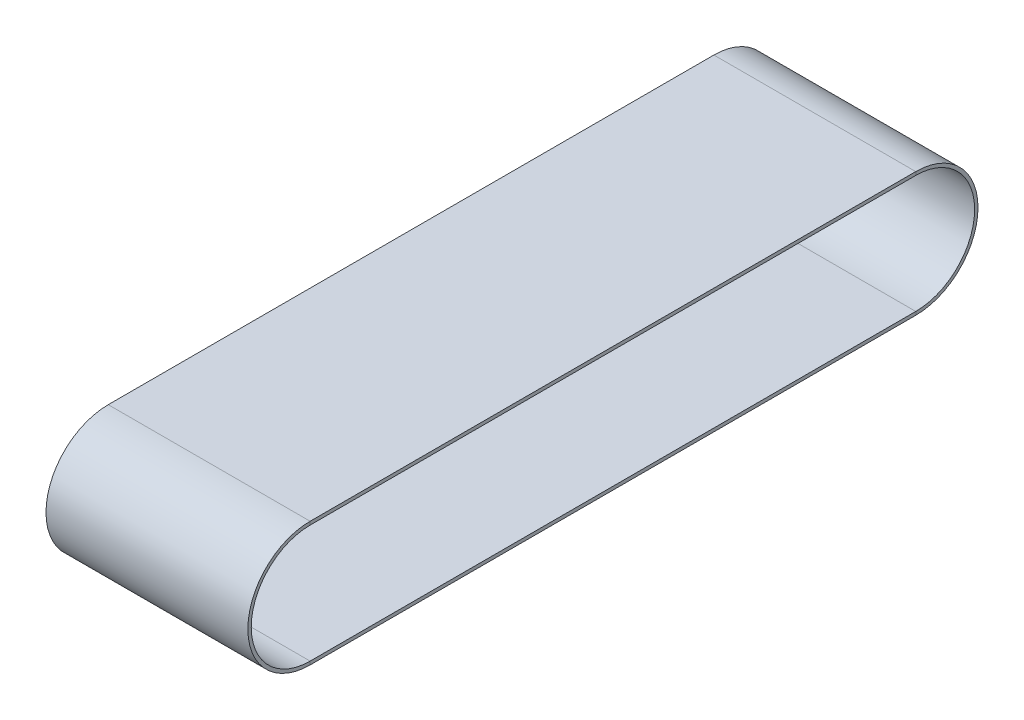
ISO-10303-21;
HEADER;
FILE_DESCRIPTION(('STEP AP214'),'2;1');
FILE_NAME('part.step','',(''),(''),'','','');
FILE_SCHEMA(('AUTOMOTIVE_DESIGN { 1 0 10303 214 1 1 1 1 }'));
ENDSEC;
DATA;
#1=APPLICATION_CONTEXT('core data for automotive mechanical design processes');
#2=APPLICATION_PROTOCOL_DEFINITION('international standard','automotive_design',2000,#1);
#3=PRODUCT_CONTEXT('',#1,'mechanical');
#4=PRODUCT('Part','Part','',(#3));
#5=PRODUCT_RELATED_PRODUCT_CATEGORY('part','',(#4));
#6=PRODUCT_DEFINITION_FORMATION('','',#4);
#7=PRODUCT_DEFINITION_CONTEXT('part definition',#1,'design');
#8=PRODUCT_DEFINITION('design','',#6,#7);
#9=PRODUCT_DEFINITION_SHAPE('','',#8);
#10=(LENGTH_UNIT() NAMED_UNIT(*) SI_UNIT(.MILLI.,.METRE.));
#11=(NAMED_UNIT(*) PLANE_ANGLE_UNIT() SI_UNIT($,.RADIAN.));
#12=(NAMED_UNIT(*) SI_UNIT($,.STERADIAN.) SOLID_ANGLE_UNIT());
#13=UNCERTAINTY_MEASURE_WITH_UNIT(LENGTH_MEASURE(1.E-05),#10,'distance_accuracy_value','');
#14=(GEOMETRIC_REPRESENTATION_CONTEXT(3) GLOBAL_UNCERTAINTY_ASSIGNED_CONTEXT((#13)) GLOBAL_UNIT_ASSIGNED_CONTEXT((#10,
#11,#12)) REPRESENTATION_CONTEXT('',''));
#15=CARTESIAN_POINT('',(0.,0.,0.));
#16=DIRECTION('',(0.,0.,1.));
#17=DIRECTION('',(1.,0.,0.));
#18=AXIS2_PLACEMENT_3D('',#15,#16,#17);
#19=CARTESIAN_POINT('',(-76.2,44.45,-457.2));
#20=DIRECTION('',(-1.,0.,0.));
#21=DIRECTION('',(0.,0.,1.));
#22=AXIS2_PLACEMENT_3D('',#19,#20,#21);
#23=PLANE('',#22);
#24=DIRECTION('',(0.,0.,1.));
#25=VECTOR('',#24,1.);
#26=CARTESIAN_POINT('',(-76.2,46.99,-457.2));
#27=LINE('',#26,#25);
#28=CARTESIAN_POINT('',(-76.2,46.99,-457.2));
#29=VERTEX_POINT('',#28);
#30=CARTESIAN_POINT('',(-76.2,46.99,0.));
#31=VERTEX_POINT('',#30);
#32=EDGE_CURVE('E11',#29,#31,#27,.T.);
#33=ORIENTED_EDGE('',*,*,#32,.F.);
#34=DIRECTION('',(0.,-1.,0.));
#35=VECTOR('',#34,1.);
#36=CARTESIAN_POINT('',(-76.2,44.45,-457.2));
#37=LINE('',#36,#35);
#38=CARTESIAN_POINT('',(-76.2,44.45,-457.2));
#39=VERTEX_POINT('',#38);
#40=EDGE_CURVE('E36',#29,#39,#37,.T.);
#41=ORIENTED_EDGE('',*,*,#40,.T.);
#42=DIRECTION('',(0.,0.,1.));
#43=VECTOR('',#42,1.);
#44=CARTESIAN_POINT('',(-76.2,44.45,-457.2));
#45=LINE('',#44,#43);
#46=CARTESIAN_POINT('',(-76.2,44.45,0.));
#47=VERTEX_POINT('',#46);
#48=EDGE_CURVE('E121',#39,#47,#45,.T.);
#49=ORIENTED_EDGE('',*,*,#48,.T.);
#50=DIRECTION('',(0.,-1.,0.));
#51=VECTOR('',#50,1.);
#52=CARTESIAN_POINT('',(-76.2,44.45,0.));
#53=LINE('',#52,#51);
#54=EDGE_CURVE('E124',#31,#47,#53,.T.);
#55=ORIENTED_EDGE('',*,*,#54,.F.);
#56=EDGE_LOOP('',(#33,#41,#49,#55));
#57=FACE_BOUND('',#56,.T.);
#58=ADVANCED_FACE('F33',(#57),#23,.T.);
#59=CARTESIAN_POINT('',(-76.2,46.99,-457.2));
#60=DIRECTION('',(0.,1.,0.));
#61=DIRECTION('',(-1.,0.,0.));
#62=AXIS2_PLACEMENT_3D('',#59,#60,#61);
#63=PLANE('',#62);
#64=DIRECTION('',(0.,0.,1.));
#65=VECTOR('',#64,1.);
#66=CARTESIAN_POINT('',(76.2,46.99,-457.2));
#67=LINE('',#66,#65);
#68=CARTESIAN_POINT('',(76.2,46.99,-457.2));
#69=VERTEX_POINT('',#68);
#70=CARTESIAN_POINT('',(76.2,46.99,0.));
#71=VERTEX_POINT('',#70);
#72=EDGE_CURVE('E41',#69,#71,#67,.T.);
#73=ORIENTED_EDGE('',*,*,#72,.F.);
#74=DIRECTION('',(-1.,0.,0.));
#75=VECTOR('',#74,1.);
#76=CARTESIAN_POINT('',(-76.2,46.99,-457.2));
#77=LINE('',#76,#75);
#78=EDGE_CURVE('E191',#69,#29,#77,.T.);
#79=ORIENTED_EDGE('',*,*,#78,.T.);
#80=ORIENTED_EDGE('',*,*,#32,.T.);
#81=DIRECTION('',(-1.,0.,0.));
#82=VECTOR('',#81,1.);
#83=CARTESIAN_POINT('',(-76.2,46.99,0.));
#84=LINE('',#83,#82);
#85=EDGE_CURVE('E149',#71,#31,#84,.T.);
#86=ORIENTED_EDGE('',*,*,#85,.F.);
#87=EDGE_LOOP('',(#73,#79,#80,#86));
#88=FACE_BOUND('',#87,.T.);
#89=ADVANCED_FACE('F215',(#88),#63,.T.);
#90=CARTESIAN_POINT('',(76.2,44.45,-457.2));
#91=DIRECTION('',(1.,0.,0.));
#92=DIRECTION('',(0.,1.,0.));
#93=AXIS2_PLACEMENT_3D('',#90,#91,#92);
#94=PLANE('',#93);
#95=DIRECTION('',(0.,0.,1.));
#96=VECTOR('',#95,1.);
#97=CARTESIAN_POINT('',(76.2,44.45,-457.2));
#98=LINE('',#97,#96);
#99=CARTESIAN_POINT('',(76.2,44.45,-457.2));
#100=VERTEX_POINT('',#99);
#101=CARTESIAN_POINT('',(76.2,44.45,0.));
#102=VERTEX_POINT('',#101);
#103=EDGE_CURVE('E130',#100,#102,#98,.T.);
#104=ORIENTED_EDGE('',*,*,#103,.F.);
#105=DIRECTION('',(0.,1.,0.));
#106=VECTOR('',#105,1.);
#107=CARTESIAN_POINT('',(76.2,44.45,-457.2));
#108=LINE('',#107,#106);
#109=EDGE_CURVE('E175',#100,#69,#108,.T.);
#110=ORIENTED_EDGE('',*,*,#109,.T.);
#111=ORIENTED_EDGE('',*,*,#72,.T.);
#112=DIRECTION('',(0.,1.,0.));
#113=VECTOR('',#112,1.);
#114=CARTESIAN_POINT('',(76.2,44.45,0.));
#115=LINE('',#114,#113);
#116=EDGE_CURVE('E153',#102,#71,#115,.T.);
#117=ORIENTED_EDGE('',*,*,#116,.F.);
#118=EDGE_LOOP('',(#104,#110,#111,#117));
#119=FACE_BOUND('',#118,.T.);
#120=ADVANCED_FACE('F220',(#119),#94,.T.);
#121=CARTESIAN_POINT('',(-76.2,-44.45,-457.2));
#122=DIRECTION('',(-1.,0.,0.));
#123=DIRECTION('',(0.,0.,1.));
#124=AXIS2_PLACEMENT_3D('',#121,#122,#123);
#125=PLANE('',#124);
#126=ORIENTED_EDGE('',*,*,#40,.F.);
#127=CARTESIAN_POINT('',(-76.2,0.,-457.2));
#128=DIRECTION('',(1.,0.,0.));
#129=DIRECTION('',(0.,-1.,0.));
#130=AXIS2_PLACEMENT_3D('',#127,#128,#129);
#131=CIRCLE('',#130,46.99);
#132=CARTESIAN_POINT('',(-76.2,-46.99,-457.2));
#133=VERTEX_POINT('',#132);
#134=EDGE_CURVE('E77',#133,#29,#131,.T.);
#135=ORIENTED_EDGE('',*,*,#134,.F.);
#136=DIRECTION('',(0.,1.,0.));
#137=VECTOR('',#136,1.);
#138=CARTESIAN_POINT('',(-76.2,-44.45,-457.2));
#139=LINE('',#138,#137);
#140=CARTESIAN_POINT('',(-76.2,-44.45,-457.2));
#141=VERTEX_POINT('',#140);
#142=EDGE_CURVE('E178',#133,#141,#139,.T.);
#143=ORIENTED_EDGE('',*,*,#142,.T.);
#144=CARTESIAN_POINT('',(-76.2,0.,-457.2));
#145=DIRECTION('',(1.,0.,0.));
#146=DIRECTION('',(0.,-1.,0.));
#147=AXIS2_PLACEMENT_3D('',#144,#145,#146);
#148=CIRCLE('',#147,44.45);
#149=EDGE_CURVE('E173',#141,#39,#148,.T.);
#150=ORIENTED_EDGE('',*,*,#149,.T.);
#151=EDGE_LOOP('',(#126,#135,#143,#150));
#152=FACE_BOUND('',#151,.T.);
#153=ADVANCED_FACE('F204',(#152),#125,.T.);
#154=CARTESIAN_POINT('',(0.,0.,-457.2));
#155=DIRECTION('',(1.,0.,0.));
#156=DIRECTION('',(0.,0.,-1.));
#157=AXIS2_PLACEMENT_3D('',#154,#155,#156);
#158=CYLINDRICAL_SURFACE('',#157,46.99);
#159=ORIENTED_EDGE('',*,*,#134,.T.);
#160=ORIENTED_EDGE('',*,*,#78,.F.);
#161=CARTESIAN_POINT('',(76.2,0.,-457.2));
#162=DIRECTION('',(1.,0.,0.));
#163=DIRECTION('',(0.,-1.,0.));
#164=AXIS2_PLACEMENT_3D('',#161,#162,#163);
#165=CIRCLE('',#164,46.99);
#166=CARTESIAN_POINT('',(76.2,-46.99,-457.2));
#167=VERTEX_POINT('',#166);
#168=EDGE_CURVE('E86',#167,#69,#165,.T.);
#169=ORIENTED_EDGE('',*,*,#168,.F.);
#170=DIRECTION('',(-1.,0.,0.));
#171=VECTOR('',#170,1.);
#172=CARTESIAN_POINT('',(-76.2,-46.99,-457.2));
#173=LINE('',#172,#171);
#174=EDGE_CURVE('E187',#167,#133,#173,.T.);
#175=ORIENTED_EDGE('',*,*,#174,.T.);
#176=EDGE_LOOP('',(#159,#160,#169,#175));
#177=FACE_BOUND('',#176,.T.);
#178=ADVANCED_FACE('F214',(#177),#158,.T.);
#179=CARTESIAN_POINT('',(76.2,-44.45,-457.2));
#180=DIRECTION('',(1.,0.,0.));
#181=DIRECTION('',(0.,0.,-1.));
#182=AXIS2_PLACEMENT_3D('',#179,#180,#181);
#183=PLANE('',#182);
#184=ORIENTED_EDGE('',*,*,#168,.T.);
#185=ORIENTED_EDGE('',*,*,#109,.F.);
#186=CARTESIAN_POINT('',(76.2,0.,-457.2));
#187=DIRECTION('',(1.,0.,0.));
#188=DIRECTION('',(0.,-1.,0.));
#189=AXIS2_PLACEMENT_3D('',#186,#187,#188);
#190=CIRCLE('',#189,44.45);
#191=CARTESIAN_POINT('',(76.2,-44.45,-457.2));
#192=VERTEX_POINT('',#191);
#193=EDGE_CURVE('E94',#192,#100,#190,.T.);
#194=ORIENTED_EDGE('',*,*,#193,.F.);
#195=DIRECTION('',(0.,-1.,0.));
#196=VECTOR('',#195,1.);
#197=CARTESIAN_POINT('',(76.2,-44.45,-457.2));
#198=LINE('',#197,#196);
#199=EDGE_CURVE('E167',#192,#167,#198,.T.);
#200=ORIENTED_EDGE('',*,*,#199,.T.);
#201=EDGE_LOOP('',(#184,#185,#194,#200));
#202=FACE_BOUND('',#201,.T.);
#203=ADVANCED_FACE('F221',(#202),#183,.T.);
#204=CARTESIAN_POINT('',(0.,0.,-457.2));
#205=DIRECTION('',(1.,0.,0.));
#206=DIRECTION('',(0.,0.,-1.));
#207=AXIS2_PLACEMENT_3D('',#204,#205,#206);
#208=CYLINDRICAL_SURFACE('',#207,44.45);
#209=ORIENTED_EDGE('',*,*,#193,.T.);
#210=DIRECTION('',(1.,0.,0.));
#211=VECTOR('',#210,1.);
#212=CARTESIAN_POINT('',(-76.2,44.45,-457.2));
#213=LINE('',#212,#211);
#214=EDGE_CURVE('E171',#39,#100,#213,.T.);
#215=ORIENTED_EDGE('',*,*,#214,.F.);
#216=ORIENTED_EDGE('',*,*,#149,.F.);
#217=DIRECTION('',(1.,0.,0.));
#218=VECTOR('',#217,1.);
#219=CARTESIAN_POINT('',(-76.2,-44.45,-457.2));
#220=LINE('',#219,#218);
#221=EDGE_CURVE('E162',#141,#192,#220,.T.);
#222=ORIENTED_EDGE('',*,*,#221,.T.);
#223=EDGE_LOOP('',(#209,#215,#216,#222));
#224=FACE_BOUND('',#223,.T.);
#225=ADVANCED_FACE('F222',(#224),#208,.F.);
#226=CARTESIAN_POINT('',(-76.2,-44.45,0.));
#227=DIRECTION('',(-1.,0.,0.));
#228=DIRECTION('',(0.,0.,1.));
#229=AXIS2_PLACEMENT_3D('',#226,#227,#228);
#230=PLANE('',#229);
#231=ORIENTED_EDGE('',*,*,#142,.F.);
#232=DIRECTION('',(0.,0.,-1.));
#233=VECTOR('',#232,1.);
#234=CARTESIAN_POINT('',(-76.2,-46.99,0.));
#235=LINE('',#234,#233);
#236=CARTESIAN_POINT('',(-76.2,-46.99,0.));
#237=VERTEX_POINT('',#236);
#238=EDGE_CURVE('E197',#237,#133,#235,.T.);
#239=ORIENTED_EDGE('',*,*,#238,.F.);
#240=DIRECTION('',(0.,1.,0.));
#241=VECTOR('',#240,1.);
#242=CARTESIAN_POINT('',(-76.2,-44.45,0.));
#243=LINE('',#242,#241);
#244=CARTESIAN_POINT('',(-76.2,-44.45,0.));
#245=VERTEX_POINT('',#244);
#246=EDGE_CURVE('E170',#237,#245,#243,.T.);
#247=ORIENTED_EDGE('',*,*,#246,.T.);
#248=DIRECTION('',(0.,0.,-1.));
#249=VECTOR('',#248,1.);
#250=CARTESIAN_POINT('',(-76.2,-44.45,0.));
#251=LINE('',#250,#249);
#252=EDGE_CURVE('E165',#245,#141,#251,.T.);
#253=ORIENTED_EDGE('',*,*,#252,.T.);
#254=EDGE_LOOP('',(#231,#239,#247,#253));
#255=FACE_BOUND('',#254,.T.);
#256=ADVANCED_FACE('F209',(#255),#230,.T.);
#257=CARTESIAN_POINT('',(-76.2,-46.99,0.));
#258=DIRECTION('',(0.,-1.,0.));
#259=DIRECTION('',(1.,0.,0.));
#260=AXIS2_PLACEMENT_3D('',#257,#258,#259);
#261=PLANE('',#260);
#262=ORIENTED_EDGE('',*,*,#238,.T.);
#263=ORIENTED_EDGE('',*,*,#174,.F.);
#264=DIRECTION('',(0.,0.,-1.));
#265=VECTOR('',#264,1.);
#266=CARTESIAN_POINT('',(76.2,-46.99,0.));
#267=LINE('',#266,#265);
#268=CARTESIAN_POINT('',(76.2,-46.99,0.));
#269=VERTEX_POINT('',#268);
#270=EDGE_CURVE('E106',#269,#167,#267,.T.);
#271=ORIENTED_EDGE('',*,*,#270,.F.);
#272=DIRECTION('',(-1.,0.,0.));
#273=VECTOR('',#272,1.);
#274=CARTESIAN_POINT('',(-76.2,-46.99,0.));
#275=LINE('',#274,#273);
#276=EDGE_CURVE('E184',#269,#237,#275,.T.);
#277=ORIENTED_EDGE('',*,*,#276,.T.);
#278=EDGE_LOOP('',(#262,#263,#271,#277));
#279=FACE_BOUND('',#278,.T.);
#280=ADVANCED_FACE('F213',(#279),#261,.T.);
#281=CARTESIAN_POINT('',(76.2,-44.45,0.));
#282=DIRECTION('',(1.,0.,0.));
#283=DIRECTION('',(0.,1.,0.));
#284=AXIS2_PLACEMENT_3D('',#281,#282,#283);
#285=PLANE('',#284);
#286=ORIENTED_EDGE('',*,*,#270,.T.);
#287=ORIENTED_EDGE('',*,*,#199,.F.);
#288=DIRECTION('',(0.,0.,-1.));
#289=VECTOR('',#288,1.);
#290=CARTESIAN_POINT('',(76.2,-44.45,0.));
#291=LINE('',#290,#289);
#292=CARTESIAN_POINT('',(76.2,-44.45,0.));
#293=VERTEX_POINT('',#292);
#294=EDGE_CURVE('E112',#293,#192,#291,.T.);
#295=ORIENTED_EDGE('',*,*,#294,.F.);
#296=DIRECTION('',(0.,-1.,0.));
#297=VECTOR('',#296,1.);
#298=CARTESIAN_POINT('',(76.2,-44.45,0.));
#299=LINE('',#298,#297);
#300=EDGE_CURVE('E160',#293,#269,#299,.T.);
#301=ORIENTED_EDGE('',*,*,#300,.T.);
#302=EDGE_LOOP('',(#286,#287,#295,#301));
#303=FACE_BOUND('',#302,.T.);
#304=ADVANCED_FACE('F275',(#303),#285,.T.);
#305=CARTESIAN_POINT('',(-76.2,-44.45,0.));
#306=DIRECTION('',(0.,1.,0.));
#307=DIRECTION('',(-1.,0.,0.));
#308=AXIS2_PLACEMENT_3D('',#305,#306,#307);
#309=PLANE('',#308);
#310=ORIENTED_EDGE('',*,*,#294,.T.);
#311=ORIENTED_EDGE('',*,*,#221,.F.);
#312=ORIENTED_EDGE('',*,*,#252,.F.);
#313=DIRECTION('',(1.,0.,0.));
#314=VECTOR('',#313,1.);
#315=CARTESIAN_POINT('',(-76.2,-44.45,0.));
#316=LINE('',#315,#314);
#317=EDGE_CURVE('E141',#245,#293,#316,.T.);
#318=ORIENTED_EDGE('',*,*,#317,.T.);
#319=EDGE_LOOP('',(#310,#311,#312,#318));
#320=FACE_BOUND('',#319,.T.);
#321=ADVANCED_FACE('F207',(#320),#309,.T.);
#322=CARTESIAN_POINT('',(-76.2,44.45,0.));
#323=DIRECTION('',(-1.,0.,0.));
#324=DIRECTION('',(0.,0.,1.));
#325=AXIS2_PLACEMENT_3D('',#322,#323,#324);
#326=PLANE('',#325);
#327=ORIENTED_EDGE('',*,*,#246,.F.);
#328=CARTESIAN_POINT('',(-76.2,0.,0.));
#329=DIRECTION('',(1.,0.,0.));
#330=DIRECTION('',(0.,1.,0.));
#331=AXIS2_PLACEMENT_3D('',#328,#329,#330);
#332=CIRCLE('',#331,46.99);
#333=EDGE_CURVE('E148',#31,#237,#332,.T.);
#334=ORIENTED_EDGE('',*,*,#333,.F.);
#335=ORIENTED_EDGE('',*,*,#54,.T.);
#336=CARTESIAN_POINT('',(-76.2,0.,0.));
#337=DIRECTION('',(1.,0.,0.));
#338=DIRECTION('',(0.,1.,0.));
#339=AXIS2_PLACEMENT_3D('',#336,#337,#338);
#340=CIRCLE('',#339,44.45);
#341=EDGE_CURVE('E136',#47,#245,#340,.T.);
#342=ORIENTED_EDGE('',*,*,#341,.T.);
#343=EDGE_LOOP('',(#327,#334,#335,#342));
#344=FACE_BOUND('',#343,.T.);
#345=ADVANCED_FACE('F146',(#344),#326,.T.);
#346=CARTESIAN_POINT('',(0.,0.,0.));
#347=DIRECTION('',(1.,0.,0.));
#348=DIRECTION('',(0.,0.,-1.));
#349=AXIS2_PLACEMENT_3D('',#346,#347,#348);
#350=CYLINDRICAL_SURFACE('',#349,46.99);
#351=ORIENTED_EDGE('',*,*,#333,.T.);
#352=ORIENTED_EDGE('',*,*,#276,.F.);
#353=CARTESIAN_POINT('',(76.2,0.,0.));
#354=DIRECTION('',(1.,0.,0.));
#355=DIRECTION('',(0.,1.,0.));
#356=AXIS2_PLACEMENT_3D('',#353,#354,#355);
#357=CIRCLE('',#356,46.99);
#358=EDGE_CURVE('E181',#71,#269,#357,.T.);
#359=ORIENTED_EDGE('',*,*,#358,.F.);
#360=ORIENTED_EDGE('',*,*,#85,.T.);
#361=EDGE_LOOP('',(#351,#352,#359,#360));
#362=FACE_BOUND('',#361,.T.);
#363=ADVANCED_FACE('F211',(#362),#350,.T.);
#364=CARTESIAN_POINT('',(76.2,44.45,0.));
#365=DIRECTION('',(1.,0.,0.));
#366=DIRECTION('',(0.,0.,-1.));
#367=AXIS2_PLACEMENT_3D('',#364,#365,#366);
#368=PLANE('',#367);
#369=ORIENTED_EDGE('',*,*,#358,.T.);
#370=ORIENTED_EDGE('',*,*,#300,.F.);
#371=CARTESIAN_POINT('',(76.2,0.,0.));
#372=DIRECTION('',(1.,0.,0.));
#373=DIRECTION('',(0.,1.,0.));
#374=AXIS2_PLACEMENT_3D('',#371,#372,#373);
#375=CIRCLE('',#374,44.45);
#376=EDGE_CURVE('E159',#102,#293,#375,.T.);
#377=ORIENTED_EDGE('',*,*,#376,.F.);
#378=ORIENTED_EDGE('',*,*,#116,.T.);
#379=EDGE_LOOP('',(#369,#370,#377,#378));
#380=FACE_BOUND('',#379,.T.);
#381=ADVANCED_FACE('F218',(#380),#368,.T.);
#382=CARTESIAN_POINT('',(0.,0.,0.));
#383=DIRECTION('',(1.,0.,0.));
#384=DIRECTION('',(0.,0.,-1.));
#385=AXIS2_PLACEMENT_3D('',#382,#383,#384);
#386=CYLINDRICAL_SURFACE('',#385,44.45);
#387=ORIENTED_EDGE('',*,*,#376,.T.);
#388=ORIENTED_EDGE('',*,*,#317,.F.);
#389=ORIENTED_EDGE('',*,*,#341,.F.);
#390=DIRECTION('',(1.,0.,0.));
#391=VECTOR('',#390,1.);
#392=CARTESIAN_POINT('',(-76.2,44.45,0.));
#393=LINE('',#392,#391);
#394=EDGE_CURVE('E139',#47,#102,#393,.T.);
#395=ORIENTED_EDGE('',*,*,#394,.T.);
#396=EDGE_LOOP('',(#387,#388,#389,#395));
#397=FACE_BOUND('',#396,.T.);
#398=ADVANCED_FACE('F138',(#397),#386,.F.);
#399=CARTESIAN_POINT('',(-76.2,44.45,-457.2));
#400=DIRECTION('',(0.,-1.,0.));
#401=DIRECTION('',(1.,0.,0.));
#402=AXIS2_PLACEMENT_3D('',#399,#400,#401);
#403=PLANE('',#402);
#404=ORIENTED_EDGE('',*,*,#214,.T.);
#405=ORIENTED_EDGE('',*,*,#103,.T.);
#406=ORIENTED_EDGE('',*,*,#394,.F.);
#407=ORIENTED_EDGE('',*,*,#48,.F.);
#408=EDGE_LOOP('',(#404,#405,#406,#407));
#409=FACE_BOUND('',#408,.T.);
#410=ADVANCED_FACE('F151',(#409),#403,.T.);
#411=CLOSED_SHELL('',(#58,#89,#120,#153,#178,#203,#225,#256,#280,#304,#321,#345,#363,#381,#398,#410));
#412=MANIFOLD_SOLID_BREP('B2',#411);
#413=ADVANCED_BREP_SHAPE_REPRESENTATION('',(#18,#412),#14);
#414=SHAPE_DEFINITION_REPRESENTATION(#9,#413);
ENDSEC;
END-ISO-10303-21;
